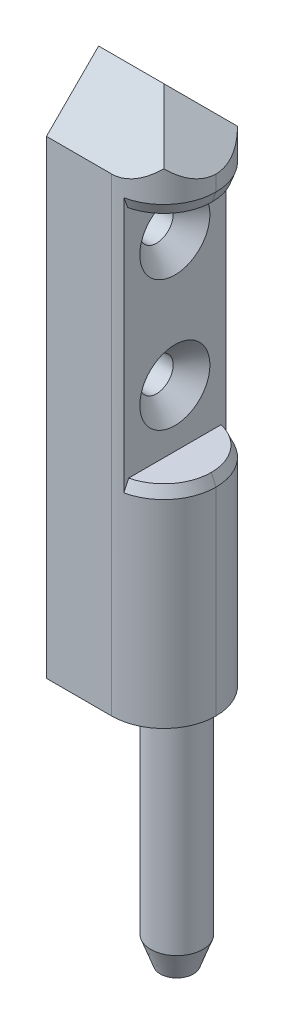
ISO-10303-21;
HEADER;
FILE_DESCRIPTION(('STEP AP214'),'2;1');
FILE_NAME('part.step','',(''),(''),'','','');
FILE_SCHEMA(('AUTOMOTIVE_DESIGN { 1 0 10303 214 1 1 1 1 }'));
ENDSEC;
DATA;
#1=APPLICATION_CONTEXT('core data for automotive mechanical design processes');
#2=APPLICATION_PROTOCOL_DEFINITION('international standard','automotive_design',2000,#1);
#3=PRODUCT_CONTEXT('',#1,'mechanical');
#4=PRODUCT('Part','Part','',(#3));
#5=PRODUCT_RELATED_PRODUCT_CATEGORY('part','',(#4));
#6=PRODUCT_DEFINITION_FORMATION('','',#4);
#7=PRODUCT_DEFINITION_CONTEXT('part definition',#1,'design');
#8=PRODUCT_DEFINITION('design','',#6,#7);
#9=PRODUCT_DEFINITION_SHAPE('','',#8);
#10=(LENGTH_UNIT() NAMED_UNIT(*) SI_UNIT(.MILLI.,.METRE.));
#11=(NAMED_UNIT(*) PLANE_ANGLE_UNIT() SI_UNIT($,.RADIAN.));
#12=(NAMED_UNIT(*) SI_UNIT($,.STERADIAN.) SOLID_ANGLE_UNIT());
#13=UNCERTAINTY_MEASURE_WITH_UNIT(LENGTH_MEASURE(1.E-05),#10,'distance_accuracy_value','');
#14=(GEOMETRIC_REPRESENTATION_CONTEXT(3) GLOBAL_UNCERTAINTY_ASSIGNED_CONTEXT((#13)) GLOBAL_UNIT_ASSIGNED_CONTEXT((#10,
#11,#12)) REPRESENTATION_CONTEXT('',''));
#15=CARTESIAN_POINT('',(0.,0.,0.));
#16=DIRECTION('',(0.,0.,1.));
#17=DIRECTION('',(1.,0.,0.));
#18=AXIS2_PLACEMENT_3D('',#15,#16,#17);
#19=CARTESIAN_POINT('',(0.,100.,10.));
#20=DIRECTION('',(1.,0.,0.));
#21=DIRECTION('',(0.,0.,-1.));
#22=AXIS2_PLACEMENT_3D('',#19,#20,#21);
#23=PLANE('',#22);
#24=CARTESIAN_POINT('',(0.,76.,0.));
#25=DIRECTION('',(1.,0.,0.));
#26=DIRECTION('',(0.,0.,-1.));
#27=AXIS2_PLACEMENT_3D('',#24,#25,#26);
#28=CIRCLE('',#27,3.19999999999999);
#29=CARTESIAN_POINT('',(0.,76.,-3.19999999999999));
#30=VERTEX_POINT('',#29);
#31=EDGE_CURVE('E323',#30,#30,#28,.T.);
#32=ORIENTED_EDGE('',*,*,#31,.T.);
#33=EDGE_LOOP('',(#32));
#34=FACE_BOUND('',#33,.T.);
#35=CARTESIAN_POINT('',(0.,51.,0.));
#36=DIRECTION('',(1.,0.,0.));
#37=DIRECTION('',(0.,0.,-1.));
#38=AXIS2_PLACEMENT_3D('',#35,#36,#37);
#39=CIRCLE('',#38,3.19999999999999);
#40=CARTESIAN_POINT('',(0.,51.,-3.19999999999999));
#41=VERTEX_POINT('',#40);
#42=EDGE_CURVE('E318',#41,#41,#39,.T.);
#43=ORIENTED_EDGE('',*,*,#42,.T.);
#44=EDGE_LOOP('',(#43));
#45=FACE_BOUND('',#44,.T.);
#46=DIRECTION('',(0.,-0.707106781186549,0.707106781186546));
#47=VECTOR('',#46,1.);
#48=CARTESIAN_POINT('',(0.,100.,0.));
#49=LINE('',#48,#47);
#50=CARTESIAN_POINT('',(0.,90.,10.));
#51=VERTEX_POINT('',#50);
#52=CARTESIAN_POINT('',(0.,100.,0.));
#53=VERTEX_POINT('',#52);
#54=EDGE_CURVE('E167',#51,#53,#49,.F.);
#55=ORIENTED_EDGE('',*,*,#54,.T.);
#56=DIRECTION('',(0.,0.707106781186549,0.707106781186546));
#57=VECTOR('',#56,1.);
#58=CARTESIAN_POINT('',(0.,100.,0.));
#59=LINE('',#58,#57);
#60=CARTESIAN_POINT('',(0.,90.,-10.));
#61=VERTEX_POINT('',#60);
#62=EDGE_CURVE('E165',#53,#61,#59,.F.);
#63=ORIENTED_EDGE('',*,*,#62,.T.);
#64=DIRECTION('',(0.,-1.,0.));
#65=VECTOR('',#64,1.);
#66=CARTESIAN_POINT('',(0.,100.,-10.));
#67=LINE('',#66,#65);
#68=CARTESIAN_POINT('',(0.,0.,-10.));
#69=VERTEX_POINT('',#68);
#70=EDGE_CURVE('E149',#61,#69,#67,.T.);
#71=ORIENTED_EDGE('',*,*,#70,.T.);
#72=DIRECTION('',(0.,0.,1.));
#73=VECTOR('',#72,1.);
#74=CARTESIAN_POINT('',(0.,0.,10.));
#75=LINE('',#74,#73);
#76=CARTESIAN_POINT('',(0.,0.,10.));
#77=VERTEX_POINT('',#76);
#78=EDGE_CURVE('E163',#69,#77,#75,.T.);
#79=ORIENTED_EDGE('',*,*,#78,.T.);
#80=DIRECTION('',(0.,-1.,0.));
#81=VECTOR('',#80,1.);
#82=CARTESIAN_POINT('',(0.,100.,10.));
#83=LINE('',#82,#81);
#84=EDGE_CURVE('E157',#51,#77,#83,.T.);
#85=ORIENTED_EDGE('',*,*,#84,.F.);
#86=EDGE_LOOP('',(#55,#63,#71,#79,#85));
#87=FACE_BOUND('',#86,.T.);
#88=ADVANCED_FACE('F47',(#34,#45,#87),#23,.F.);
#89=CARTESIAN_POINT('',(2.12,100.,10.));
#90=DIRECTION('',(0.,0.,-1.));
#91=DIRECTION('',(-1.,0.,0.));
#92=AXIS2_PLACEMENT_3D('',#89,#90,#91);
#93=PLANE('',#92);
#94=DIRECTION('',(1.,0.,0.));
#95=VECTOR('',#94,1.);
#96=CARTESIAN_POINT('',(2.12,0.,10.));
#97=LINE('',#96,#95);
#98=CARTESIAN_POINT('',(12.5,0.,10.));
#99=VERTEX_POINT('',#98);
#100=EDGE_CURVE('E158',#77,#99,#97,.T.);
#101=ORIENTED_EDGE('',*,*,#100,.T.);
#102=DIRECTION('',(0.,-1.,0.));
#103=VECTOR('',#102,1.);
#104=CARTESIAN_POINT('',(12.5,100.,10.));
#105=LINE('',#104,#103);
#106=CARTESIAN_POINT('',(12.5,90.,10.));
#107=VERTEX_POINT('',#106);
#108=EDGE_CURVE('E220',#99,#107,#105,.F.);
#109=ORIENTED_EDGE('',*,*,#108,.T.);
#110=DIRECTION('',(-1.,0.,0.));
#111=VECTOR('',#110,1.);
#112=CARTESIAN_POINT('',(2.12,90.,10.));
#113=LINE('',#112,#111);
#114=EDGE_CURVE('E192',#107,#51,#113,.T.);
#115=ORIENTED_EDGE('',*,*,#114,.T.);
#116=ORIENTED_EDGE('',*,*,#84,.T.);
#117=EDGE_LOOP('',(#101,#109,#115,#116));
#118=FACE_BOUND('',#117,.T.);
#119=ADVANCED_FACE('F343',(#118),#93,.F.);
#120=CARTESIAN_POINT('',(2.12,100.,-10.));
#121=DIRECTION('',(0.,0.,1.));
#122=DIRECTION('',(1.,0.,0.));
#123=AXIS2_PLACEMENT_3D('',#120,#121,#122);
#124=PLANE('',#123);
#125=DIRECTION('',(1.,0.,0.));
#126=VECTOR('',#125,1.);
#127=CARTESIAN_POINT('',(2.12,90.,-10.));
#128=LINE('',#127,#126);
#129=CARTESIAN_POINT('',(12.5,90.,-10.));
#130=VERTEX_POINT('',#129);
#131=EDGE_CURVE('E189',#61,#130,#128,.T.);
#132=ORIENTED_EDGE('',*,*,#131,.T.);
#133=DIRECTION('',(0.,-1.,0.));
#134=VECTOR('',#133,1.);
#135=CARTESIAN_POINT('',(12.5,100.,-10.));
#136=LINE('',#135,#134);
#137=CARTESIAN_POINT('',(12.5,0.,-10.));
#138=VERTEX_POINT('',#137);
#139=EDGE_CURVE('E152',#130,#138,#136,.T.);
#140=ORIENTED_EDGE('',*,*,#139,.T.);
#141=DIRECTION('',(-1.,0.,0.));
#142=VECTOR('',#141,1.);
#143=CARTESIAN_POINT('',(2.12,0.,-10.));
#144=LINE('',#143,#142);
#145=EDGE_CURVE('E145',#138,#69,#144,.T.);
#146=ORIENTED_EDGE('',*,*,#145,.T.);
#147=ORIENTED_EDGE('',*,*,#70,.F.);
#148=EDGE_LOOP('',(#132,#140,#146,#147));
#149=FACE_BOUND('',#148,.T.);
#150=ADVANCED_FACE('F148',(#149),#124,.F.);
#151=CARTESIAN_POINT('',(0.,0.,0.));
#152=DIRECTION('',(0.,-1.,0.));
#153=DIRECTION('',(0.,0.,-1.));
#154=AXIS2_PLACEMENT_3D('',#151,#152,#153);
#155=PLANE('',#154);
#156=CARTESIAN_POINT('',(15.,0.,0.));
#157=DIRECTION('',(0.,-1.,0.));
#158=DIRECTION('',(0.,0.,-1.));
#159=AXIS2_PLACEMENT_3D('',#156,#157,#158);
#160=CIRCLE('',#159,4.99999999999999);
#161=CARTESIAN_POINT('',(15.,0.,4.99999999999999));
#162=VERTEX_POINT('',#161);
#163=EDGE_CURVE('E434',#162,#162,#160,.T.);
#164=ORIENTED_EDGE('',*,*,#163,.F.);
#165=EDGE_LOOP('',(#164));
#166=FACE_BOUND('',#165,.T.);
#167=ORIENTED_EDGE('',*,*,#145,.F.);
#168=CARTESIAN_POINT('',(12.5,0.,0.));
#169=DIRECTION('',(0.,-1.,0.));
#170=DIRECTION('',(0.,0.,-1.));
#171=AXIS2_PLACEMENT_3D('',#168,#169,#170);
#172=CIRCLE('',#171,10.);
#173=CARTESIAN_POINT('',(22.5,0.,0.));
#174=VERTEX_POINT('',#173);
#175=EDGE_CURVE('E208',#138,#174,#172,.T.);
#176=ORIENTED_EDGE('',*,*,#175,.T.);
#177=CARTESIAN_POINT('',(12.5,0.,0.));
#178=DIRECTION('',(0.,-1.,0.));
#179=DIRECTION('',(0.,0.,-1.));
#180=AXIS2_PLACEMENT_3D('',#177,#178,#179);
#181=CIRCLE('',#180,10.);
#182=EDGE_CURVE('E205',#174,#99,#181,.T.);
#183=ORIENTED_EDGE('',*,*,#182,.T.);
#184=ORIENTED_EDGE('',*,*,#100,.F.);
#185=ORIENTED_EDGE('',*,*,#78,.F.);
#186=EDGE_LOOP('',(#167,#176,#183,#184,#185));
#187=FACE_BOUND('',#186,.T.);
#188=ADVANCED_FACE('F170',(#166,#187),#155,.T.);
#189=CARTESIAN_POINT('',(12.5,100.,0.));
#190=DIRECTION('',(-0.707106781186549,-0.707106781186546,0.));
#191=DIRECTION('',(0.,0.,-1.));
#192=AXIS2_PLACEMENT_3D('',#189,#190,#191);
#193=PLANE('',#192);
#194=CARTESIAN_POINT('',(12.5,100.,0.));
#195=DIRECTION('',(-0.707106781186549,-0.707106781186546,0.));
#196=DIRECTION('',(0.707106781186546,-0.707106781186549,0.));
#197=AXIS2_PLACEMENT_3D('',#194,#195,#196);
#198=ELLIPSE('',#197,14.142135623731,10.);
#199=CARTESIAN_POINT('',(19.5710678118655,92.9289321881345,7.07106781186547));
#200=VERTEX_POINT('',#199);
#201=CARTESIAN_POINT('',(22.5,90.,0.));
#202=VERTEX_POINT('',#201);
#203=EDGE_CURVE('E211',#200,#202,#198,.F.);
#204=ORIENTED_EDGE('',*,*,#203,.T.);
#205=CARTESIAN_POINT('',(12.5,100.,0.));
#206=DIRECTION('',(-0.707106781186549,-0.707106781186546,0.));
#207=DIRECTION('',(0.707106781186546,-0.707106781186549,0.));
#208=AXIS2_PLACEMENT_3D('',#205,#206,#207);
#209=ELLIPSE('',#208,14.142135623731,10.);
#210=CARTESIAN_POINT('',(19.5710678118655,92.9289321881345,-7.07106781186548));
#211=VERTEX_POINT('',#210);
#212=EDGE_CURVE('E214',#202,#211,#209,.F.);
#213=ORIENTED_EDGE('',*,*,#212,.T.);
#214=DIRECTION('',(-0.577350269189625,0.577350269189628,0.577350269189625));
#215=VECTOR('',#214,1.);
#216=CARTESIAN_POINT('',(12.5,100.,0.));
#217=LINE('',#216,#215);
#218=CARTESIAN_POINT('',(12.5,100.,0.));
#219=VERTEX_POINT('',#218);
#220=EDGE_CURVE('E178',#219,#211,#217,.F.);
#221=ORIENTED_EDGE('',*,*,#220,.F.);
#222=DIRECTION('',(-0.577350269189625,0.577350269189628,-0.577350269189625));
#223=VECTOR('',#222,1.);
#224=CARTESIAN_POINT('',(8.33333333333336,104.166666666667,-4.16666666666665));
#225=LINE('',#224,#223);
#226=EDGE_CURVE('E173',#200,#219,#225,.T.);
#227=ORIENTED_EDGE('',*,*,#226,.F.);
#228=EDGE_LOOP('',(#204,#213,#221,#227));
#229=FACE_BOUND('',#228,.T.);
#230=ADVANCED_FACE('F367',(#229),#193,.F.);
#231=CARTESIAN_POINT('',(0.,100.,0.));
#232=DIRECTION('',(0.,-0.707106781186546,-0.707106781186549));
#233=DIRECTION('',(1.,0.,0.));
#234=AXIS2_PLACEMENT_3D('',#231,#232,#233);
#235=PLANE('',#234);
#236=ORIENTED_EDGE('',*,*,#114,.F.);
#237=CARTESIAN_POINT('',(12.5,100.,0.));
#238=DIRECTION('',(0.,-0.707106781186546,-0.707106781186549));
#239=DIRECTION('',(0.,-0.707106781186549,0.707106781186546));
#240=AXIS2_PLACEMENT_3D('',#237,#238,#239);
#241=ELLIPSE('',#240,14.142135623731,10.);
#242=EDGE_CURVE('E223',#107,#200,#241,.F.);
#243=ORIENTED_EDGE('',*,*,#242,.T.);
#244=ORIENTED_EDGE('',*,*,#226,.T.);
#245=DIRECTION('',(1.,0.,0.));
#246=VECTOR('',#245,1.);
#247=CARTESIAN_POINT('',(0.,100.,0.));
#248=LINE('',#247,#246);
#249=EDGE_CURVE('E195',#53,#219,#248,.T.);
#250=ORIENTED_EDGE('',*,*,#249,.F.);
#251=ORIENTED_EDGE('',*,*,#54,.F.);
#252=EDGE_LOOP('',(#236,#243,#244,#250,#251));
#253=FACE_BOUND('',#252,.T.);
#254=ADVANCED_FACE('F360',(#253),#235,.F.);
#255=CARTESIAN_POINT('',(0.,100.,0.));
#256=DIRECTION('',(0.,-0.707106781186546,0.707106781186549));
#257=DIRECTION('',(-1.,0.,0.));
#258=AXIS2_PLACEMENT_3D('',#255,#256,#257);
#259=PLANE('',#258);
#260=ORIENTED_EDGE('',*,*,#220,.T.);
#261=CARTESIAN_POINT('',(12.5,100.,0.));
#262=DIRECTION('',(0.,-0.707106781186546,0.707106781186549));
#263=DIRECTION('',(0.,-0.707106781186549,-0.707106781186546));
#264=AXIS2_PLACEMENT_3D('',#261,#262,#263);
#265=ELLIPSE('',#264,14.142135623731,10.);
#266=EDGE_CURVE('E217',#211,#130,#265,.F.);
#267=ORIENTED_EDGE('',*,*,#266,.T.);
#268=ORIENTED_EDGE('',*,*,#131,.F.);
#269=ORIENTED_EDGE('',*,*,#62,.F.);
#270=ORIENTED_EDGE('',*,*,#249,.T.);
#271=EDGE_LOOP('',(#260,#267,#268,#269,#270));
#272=FACE_BOUND('',#271,.T.);
#273=ADVANCED_FACE('F354',(#272),#259,.F.);
#274=CARTESIAN_POINT('',(12.5,100.,0.));
#275=DIRECTION('',(0.,-1.,0.));
#276=DIRECTION('',(0.,0.,-1.));
#277=AXIS2_PLACEMENT_3D('',#274,#275,#276);
#278=CYLINDRICAL_SURFACE('',#277,10.);
#279=DIRECTION('',(0.,-1.,0.));
#280=VECTOR('',#279,1.);
#281=CARTESIAN_POINT('',(14.62,100.,9.7726966595715));
#282=LINE('',#281,#280);
#283=CARTESIAN_POINT('',(14.62,87.,9.7726966595715));
#284=VERTEX_POINT('',#283);
#285=CARTESIAN_POINT('',(14.62,38.,9.7726966595715));
#286=VERTEX_POINT('',#285);
#287=EDGE_CURVE('E72',#284,#286,#282,.T.);
#288=ORIENTED_EDGE('',*,*,#287,.F.);
#289=CARTESIAN_POINT('',(12.5,87.,0.));
#290=DIRECTION('',(0.,1.,0.));
#291=DIRECTION('',(0.,0.,1.));
#292=AXIS2_PLACEMENT_3D('',#289,#290,#291);
#293=CIRCLE('',#292,10.);
#294=CARTESIAN_POINT('',(22.5,87.,0.));
#295=VERTEX_POINT('',#294);
#296=EDGE_CURVE('E395',#284,#295,#293,.T.);
#297=ORIENTED_EDGE('',*,*,#296,.T.);
#298=DIRECTION('',(0.,-1.,0.));
#299=VECTOR('',#298,1.);
#300=CARTESIAN_POINT('',(22.5,100.,0.));
#301=LINE('',#300,#299);
#302=EDGE_CURVE('E199',#202,#295,#301,.T.);
#303=ORIENTED_EDGE('',*,*,#302,.F.);
#304=ORIENTED_EDGE('',*,*,#203,.F.);
#305=ORIENTED_EDGE('',*,*,#242,.F.);
#306=ORIENTED_EDGE('',*,*,#108,.F.);
#307=ORIENTED_EDGE('',*,*,#182,.F.);
#308=CARTESIAN_POINT('',(22.5,38.,0.));
#309=VERTEX_POINT('',#308);
#310=EDGE_CURVE('E229',#309,#174,#301,.T.);
#311=ORIENTED_EDGE('',*,*,#310,.F.);
#312=CARTESIAN_POINT('',(12.5,38.,0.));
#313=DIRECTION('',(0.,-1.,0.));
#314=DIRECTION('',(0.,0.,-1.));
#315=AXIS2_PLACEMENT_3D('',#312,#313,#314);
#316=CIRCLE('',#315,10.);
#317=EDGE_CURVE('E239',#309,#286,#316,.T.);
#318=ORIENTED_EDGE('',*,*,#317,.T.);
#319=EDGE_LOOP('',(#288,#297,#303,#304,#305,#306,#307,#311,#318));
#320=FACE_BOUND('',#319,.T.);
#321=ADVANCED_FACE('F277',(#320),#278,.T.);
#322=CARTESIAN_POINT('',(12.5,100.,0.));
#323=DIRECTION('',(0.,-1.,0.));
#324=DIRECTION('',(0.,0.,-1.));
#325=AXIS2_PLACEMENT_3D('',#322,#323,#324);
#326=CYLINDRICAL_SURFACE('',#325,10.);
#327=ORIENTED_EDGE('',*,*,#302,.T.);
#328=CARTESIAN_POINT('',(12.5,87.,0.));
#329=DIRECTION('',(0.,1.,0.));
#330=DIRECTION('',(0.,0.,1.));
#331=AXIS2_PLACEMENT_3D('',#328,#329,#330);
#332=CIRCLE('',#331,10.);
#333=CARTESIAN_POINT('',(14.62,87.,-9.7726966595715));
#334=VERTEX_POINT('',#333);
#335=EDGE_CURVE('E305',#295,#334,#332,.T.);
#336=ORIENTED_EDGE('',*,*,#335,.T.);
#337=DIRECTION('',(0.,-1.,0.));
#338=VECTOR('',#337,1.);
#339=CARTESIAN_POINT('',(14.62,100.,-9.7726966595715));
#340=LINE('',#339,#338);
#341=CARTESIAN_POINT('',(14.62,38.,-9.7726966595715));
#342=VERTEX_POINT('',#341);
#343=EDGE_CURVE('E64',#342,#334,#340,.F.);
#344=ORIENTED_EDGE('',*,*,#343,.F.);
#345=CARTESIAN_POINT('',(12.5,38.,0.));
#346=DIRECTION('',(0.,-1.,0.));
#347=DIRECTION('',(0.,0.,-1.));
#348=AXIS2_PLACEMENT_3D('',#345,#346,#347);
#349=CIRCLE('',#348,10.);
#350=EDGE_CURVE('E242',#342,#309,#349,.T.);
#351=ORIENTED_EDGE('',*,*,#350,.T.);
#352=ORIENTED_EDGE('',*,*,#310,.T.);
#353=ORIENTED_EDGE('',*,*,#175,.F.);
#354=ORIENTED_EDGE('',*,*,#139,.F.);
#355=ORIENTED_EDGE('',*,*,#266,.F.);
#356=ORIENTED_EDGE('',*,*,#212,.F.);
#357=EDGE_LOOP('',(#327,#336,#344,#351,#352,#353,#354,#355,#356));
#358=FACE_BOUND('',#357,.T.);
#359=ADVANCED_FACE('F373',(#358),#326,.T.);
#360=CARTESIAN_POINT('',(114.62,40.,-10.));
#361=DIRECTION('',(0.,-1.,0.));
#362=DIRECTION('',(0.,0.,-1.));
#363=AXIS2_PLACEMENT_3D('',#360,#361,#362);
#364=PLANE('',#363);
#365=DIRECTION('',(0.,0.,1.));
#366=VECTOR('',#365,1.);
#367=CARTESIAN_POINT('',(14.62,40.,-10.));
#368=LINE('',#367,#366);
#369=CARTESIAN_POINT('',(14.62,40.,-8.85942249339906));
#370=VERTEX_POINT('',#369);
#371=CARTESIAN_POINT('',(14.62,40.,8.85942249339906));
#372=VERTEX_POINT('',#371);
#373=EDGE_CURVE('E409',#370,#372,#368,.T.);
#374=ORIENTED_EDGE('',*,*,#373,.T.);
#375=CARTESIAN_POINT('',(12.5,40.,0.));
#376=DIRECTION('',(0.,-1.,0.));
#377=DIRECTION('',(0.,0.,-1.));
#378=AXIS2_PLACEMENT_3D('',#375,#376,#377);
#379=CIRCLE('',#378,9.10954262938294);
#380=CARTESIAN_POINT('',(21.609542629383,40.,0.));
#381=VERTEX_POINT('',#380);
#382=EDGE_CURVE('E235',#372,#381,#379,.F.);
#383=ORIENTED_EDGE('',*,*,#382,.T.);
#384=CARTESIAN_POINT('',(12.5,40.,0.));
#385=DIRECTION('',(0.,-1.,0.));
#386=DIRECTION('',(0.,0.,-1.));
#387=AXIS2_PLACEMENT_3D('',#384,#385,#386);
#388=CIRCLE('',#387,9.10954262938295);
#389=EDGE_CURVE('E232',#381,#370,#388,.F.);
#390=ORIENTED_EDGE('',*,*,#389,.T.);
#391=EDGE_LOOP('',(#374,#383,#390));
#392=FACE_BOUND('',#391,.T.);
#393=ADVANCED_FACE('F375',(#392),#364,.F.);
#394=CARTESIAN_POINT('',(114.62,85.,10.));
#395=DIRECTION('',(0.,1.,0.));
#396=DIRECTION('',(0.,0.,1.));
#397=AXIS2_PLACEMENT_3D('',#394,#395,#396);
#398=PLANE('',#397);
#399=CARTESIAN_POINT('',(12.5,85.,0.));
#400=DIRECTION('',(0.,1.,0.));
#401=DIRECTION('',(0.,0.,1.));
#402=AXIS2_PLACEMENT_3D('',#399,#400,#401);
#403=CIRCLE('',#402,9.27205953146757);
#404=CARTESIAN_POINT('',(14.62,85.,-9.0264438155388));
#405=VERTEX_POINT('',#404);
#406=CARTESIAN_POINT('',(21.7720595314676,85.,0.));
#407=VERTEX_POINT('',#406);
#408=EDGE_CURVE('E403',#405,#407,#403,.F.);
#409=ORIENTED_EDGE('',*,*,#408,.T.);
#410=CARTESIAN_POINT('',(12.5,85.,0.));
#411=DIRECTION('',(0.,1.,0.));
#412=DIRECTION('',(0.,0.,1.));
#413=AXIS2_PLACEMENT_3D('',#410,#411,#412);
#414=CIRCLE('',#413,9.27205953146757);
#415=CARTESIAN_POINT('',(14.62,85.,9.0264438155388));
#416=VERTEX_POINT('',#415);
#417=EDGE_CURVE('E398',#407,#416,#414,.F.);
#418=ORIENTED_EDGE('',*,*,#417,.T.);
#419=DIRECTION('',(0.,0.,-1.));
#420=VECTOR('',#419,1.);
#421=CARTESIAN_POINT('',(14.62,85.,10.));
#422=LINE('',#421,#420);
#423=EDGE_CURVE('E416',#416,#405,#422,.T.);
#424=ORIENTED_EDGE('',*,*,#423,.T.);
#425=EDGE_LOOP('',(#409,#418,#424));
#426=FACE_BOUND('',#425,.T.);
#427=ADVANCED_FACE('F381',(#426),#398,.F.);
#428=CARTESIAN_POINT('',(14.62,0.,0.));
#429=DIRECTION('',(-1.,0.,0.));
#430=DIRECTION('',(0.,0.,1.));
#431=AXIS2_PLACEMENT_3D('',#428,#429,#430);
#432=PLANE('',#431);
#433=CARTESIAN_POINT('',(14.62,76.,0.));
#434=DIRECTION('',(1.,0.,0.));
#435=DIRECTION('',(0.,0.,-1.));
#436=AXIS2_PLACEMENT_3D('',#433,#434,#435);
#437=CIRCLE('',#436,6.72);
#438=CARTESIAN_POINT('',(14.62,76.,-6.72));
#439=VERTEX_POINT('',#438);
#440=EDGE_CURVE('E430',#439,#439,#437,.T.);
#441=ORIENTED_EDGE('',*,*,#440,.F.);
#442=EDGE_LOOP('',(#441));
#443=FACE_BOUND('',#442,.T.);
#444=CARTESIAN_POINT('',(14.62,51.,0.));
#445=DIRECTION('',(1.,0.,0.));
#446=DIRECTION('',(0.,0.,-1.));
#447=AXIS2_PLACEMENT_3D('',#444,#445,#446);
#448=CIRCLE('',#447,6.72);
#449=CARTESIAN_POINT('',(14.62,51.,-6.72));
#450=VERTEX_POINT('',#449);
#451=EDGE_CURVE('E326',#450,#450,#448,.T.);
#452=ORIENTED_EDGE('',*,*,#451,.F.);
#453=EDGE_LOOP('',(#452));
#454=FACE_BOUND('',#453,.T.);
#455=ORIENTED_EDGE('',*,*,#287,.T.);
#456=CARTESIAN_POINT('',(14.62,38.,9.7726966595715));
#457=CARTESIAN_POINT('',(14.62,38.3334724288597,9.62078891560253));
#458=CARTESIAN_POINT('',(14.62,38.6668753083353,9.46872886384559));
#459=CARTESIAN_POINT('',(14.62,39.3335419750047,9.16430414179404));
#460=CARTESIAN_POINT('',(14.62,39.6668057621957,9.01193947149349));
#461=CARTESIAN_POINT('',(14.62,39.9999999999999,8.85942249339906));
#462=B_SPLINE_CURVE_WITH_KNOTS('',3,(#456,#457,#458,#459,#460,#461),.UNSPECIFIED.,.F.,.F.,(4,2,
4),(0.,1.0993260000777,2.19865202154637),.UNSPECIFIED.);
#463=EDGE_CURVE('E245',#286,#372,#462,.T.);
#464=ORIENTED_EDGE('',*,*,#463,.T.);
#465=ORIENTED_EDGE('',*,*,#373,.F.);
#466=CARTESIAN_POINT('',(14.62,40.,-8.85942249339906));
#467=CARTESIAN_POINT('',(14.62,39.6668057621957,-9.01193947149349));
#468=CARTESIAN_POINT('',(14.62,39.3335419750047,-9.16430414179404));
#469=CARTESIAN_POINT('',(14.62,38.6668753083353,-9.46872886384559));
#470=CARTESIAN_POINT('',(14.62,38.3334724288597,-9.62078891560252));
#471=CARTESIAN_POINT('',(14.62,38.,-9.7726966595715));
#472=B_SPLINE_CURVE_WITH_KNOTS('',3,(#466,#467,#468,#469,#470,#471),.UNSPECIFIED.,.F.,.F.,(4,2,
4),(0.,1.09932602146867,2.19865202154637),.UNSPECIFIED.);
#473=EDGE_CURVE('E254',#370,#342,#472,.T.);
#474=ORIENTED_EDGE('',*,*,#473,.T.);
#475=ORIENTED_EDGE('',*,*,#343,.T.);
#476=CARTESIAN_POINT('',(14.62,87.,-9.7726966595715));
#477=CARTESIAN_POINT('',(14.62,86.6665882796528,-9.64853127103235));
#478=CARTESIAN_POINT('',(14.62,86.3332157534375,-9.52426083999372));
#479=CARTESIAN_POINT('',(14.62,85.6665490867702,-9.27550989198439));
#480=CARTESIAN_POINT('',(14.62,85.3332549463188,-9.15102937501212));
#481=CARTESIAN_POINT('',(14.62,84.9999999999999,-9.0264438155388));
#482=B_SPLINE_CURVE_WITH_KNOTS('',3,(#476,#477,#478,#479,#480,#481),.UNSPECIFIED.,.F.,.F.,(4,2,
4),(0.,1.06734410168004,2.13468821136746),.UNSPECIFIED.);
#483=EDGE_CURVE('E304',#334,#405,#482,.T.);
#484=ORIENTED_EDGE('',*,*,#483,.T.);
#485=ORIENTED_EDGE('',*,*,#423,.F.);
#486=CARTESIAN_POINT('',(14.62,85.,9.0264438155388));
#487=CARTESIAN_POINT('',(14.62,85.3332549463188,9.15102937501213));
#488=CARTESIAN_POINT('',(14.62,85.6665490867702,9.27550989198439));
#489=CARTESIAN_POINT('',(14.62,86.3332157534375,9.52426083999372));
#490=CARTESIAN_POINT('',(14.62,86.6665882796528,9.64853127103235));
#491=CARTESIAN_POINT('',(14.62,87.,9.7726966595715));
#492=B_SPLINE_CURVE_WITH_KNOTS('',3,(#486,#487,#488,#489,#490,#491),.UNSPECIFIED.,.F.,.F.,(4,2,
4),(0.,1.06734410968741,2.13468821136745),.UNSPECIFIED.);
#493=EDGE_CURVE('E296',#416,#284,#492,.T.);
#494=ORIENTED_EDGE('',*,*,#493,.T.);
#495=EDGE_LOOP('',(#455,#464,#465,#474,#475,#484,#485,#494));
#496=FACE_BOUND('',#495,.T.);
#497=ADVANCED_FACE('F261',(#443,#454,#496),#432,.F.);
#498=CARTESIAN_POINT('',(12.5,40.,0.));
#499=DIRECTION('',(0.,-1.,0.));
#500=DIRECTION('',(0.,0.,-1.));
#501=AXIS2_PLACEMENT_3D('',#498,#499,#500);
#502=CONICAL_SURFACE('',#501,9.10954262938295,0.418879020478636);
#503=ORIENTED_EDGE('',*,*,#473,.F.);
#504=ORIENTED_EDGE('',*,*,#389,.F.);
#505=DIRECTION('',(-0.406736643075797,0.913545457642602,0.));
#506=VECTOR('',#505,1.);
#507=CARTESIAN_POINT('',(22.5,38.,0.));
#508=LINE('',#507,#506);
#509=EDGE_CURVE('E317',#309,#381,#508,.T.);
#510=ORIENTED_EDGE('',*,*,#509,.F.);
#511=ORIENTED_EDGE('',*,*,#350,.F.);
#512=EDGE_LOOP('',(#503,#504,#510,#511));
#513=FACE_BOUND('',#512,.T.);
#514=ADVANCED_FACE('F275',(#513),#502,.T.);
#515=CARTESIAN_POINT('',(12.5,40.,0.));
#516=DIRECTION('',(0.,-1.,0.));
#517=DIRECTION('',(0.,0.,-1.));
#518=AXIS2_PLACEMENT_3D('',#515,#516,#517);
#519=CONICAL_SURFACE('',#518,9.10954262938294,0.418879020478637);
#520=ORIENTED_EDGE('',*,*,#463,.F.);
#521=ORIENTED_EDGE('',*,*,#317,.F.);
#522=ORIENTED_EDGE('',*,*,#509,.T.);
#523=ORIENTED_EDGE('',*,*,#382,.F.);
#524=EDGE_LOOP('',(#520,#521,#522,#523));
#525=FACE_BOUND('',#524,.T.);
#526=ADVANCED_FACE('F266',(#525),#519,.T.);
#527=CARTESIAN_POINT('',(12.5,85.,0.));
#528=DIRECTION('',(0.,1.,0.));
#529=DIRECTION('',(0.,0.,1.));
#530=AXIS2_PLACEMENT_3D('',#527,#528,#529);
#531=CONICAL_SURFACE('',#530,9.27205953146757,0.349065850398861);
#532=ORIENTED_EDGE('',*,*,#483,.F.);
#533=ORIENTED_EDGE('',*,*,#335,.F.);
#534=DIRECTION('',(0.342020143325663,0.93969262078591,0.));
#535=VECTOR('',#534,1.);
#536=CARTESIAN_POINT('',(21.7720595314676,85.,0.));
#537=LINE('',#536,#535);
#538=EDGE_CURVE('E313',#407,#295,#537,.T.);
#539=ORIENTED_EDGE('',*,*,#538,.F.);
#540=ORIENTED_EDGE('',*,*,#408,.F.);
#541=EDGE_LOOP('',(#532,#533,#539,#540));
#542=FACE_BOUND('',#541,.T.);
#543=ADVANCED_FACE('F274',(#542),#531,.T.);
#544=CARTESIAN_POINT('',(12.5,85.,0.));
#545=DIRECTION('',(0.,1.,0.));
#546=DIRECTION('',(0.,0.,1.));
#547=AXIS2_PLACEMENT_3D('',#544,#545,#546);
#548=CONICAL_SURFACE('',#547,9.27205953146757,0.349065850398861);
#549=ORIENTED_EDGE('',*,*,#538,.T.);
#550=ORIENTED_EDGE('',*,*,#296,.F.);
#551=ORIENTED_EDGE('',*,*,#493,.F.);
#552=ORIENTED_EDGE('',*,*,#417,.F.);
#553=EDGE_LOOP('',(#549,#550,#551,#552));
#554=FACE_BOUND('',#553,.T.);
#555=ADVANCED_FACE('F287',(#554),#548,.T.);
#556=CARTESIAN_POINT('',(14.62,51.,0.));
#557=DIRECTION('',(1.,0.,0.));
#558=DIRECTION('',(0.,0.,-1.));
#559=AXIS2_PLACEMENT_3D('',#556,#557,#558);
#560=CYLINDRICAL_SURFACE('',#559,3.19999999999999);
#561=CARTESIAN_POINT('',(11.1,51.,0.));
#562=DIRECTION('',(1.,0.,0.));
#563=DIRECTION('',(0.,0.,-1.));
#564=AXIS2_PLACEMENT_3D('',#561,#562,#563);
#565=CIRCLE('',#564,3.19999999999999);
#566=CARTESIAN_POINT('',(11.1,51.,-3.2));
#567=VERTEX_POINT('',#566);
#568=EDGE_CURVE('E322',#567,#567,#565,.T.);
#569=ORIENTED_EDGE('',*,*,#568,.T.);
#570=EDGE_LOOP('',(#569));
#571=FACE_BOUND('',#570,.T.);
#572=ORIENTED_EDGE('',*,*,#42,.F.);
#573=EDGE_LOOP('',(#572));
#574=FACE_BOUND('',#573,.T.);
#575=ADVANCED_FACE('F292',(#571,#574),#560,.F.);
#576=CARTESIAN_POINT('',(14.62,51.,0.));
#577=DIRECTION('',(1.,0.,0.));
#578=DIRECTION('',(0.,0.,-1.));
#579=AXIS2_PLACEMENT_3D('',#576,#577,#578);
#580=CONICAL_SURFACE('',#579,6.72,0.785398163397448);
#581=ORIENTED_EDGE('',*,*,#568,.F.);
#582=EDGE_LOOP('',(#581));
#583=FACE_BOUND('',#582,.T.);
#584=ORIENTED_EDGE('',*,*,#451,.T.);
#585=EDGE_LOOP('',(#584));
#586=FACE_BOUND('',#585,.T.);
#587=ADVANCED_FACE('F471',(#583,#586),#580,.F.);
#588=CARTESIAN_POINT('',(14.62,76.,0.));
#589=DIRECTION('',(1.,0.,0.));
#590=DIRECTION('',(0.,0.,-1.));
#591=AXIS2_PLACEMENT_3D('',#588,#589,#590);
#592=CYLINDRICAL_SURFACE('',#591,3.19999999999999);
#593=CARTESIAN_POINT('',(11.1,76.,0.));
#594=DIRECTION('',(1.,0.,0.));
#595=DIRECTION('',(0.,0.,-1.));
#596=AXIS2_PLACEMENT_3D('',#593,#594,#595);
#597=CIRCLE('',#596,3.19999999999999);
#598=CARTESIAN_POINT('',(11.1,76.,-3.19999999999999));
#599=VERTEX_POINT('',#598);
#600=EDGE_CURVE('E327',#599,#599,#597,.T.);
#601=ORIENTED_EDGE('',*,*,#600,.T.);
#602=EDGE_LOOP('',(#601));
#603=FACE_BOUND('',#602,.T.);
#604=ORIENTED_EDGE('',*,*,#31,.F.);
#605=EDGE_LOOP('',(#604));
#606=FACE_BOUND('',#605,.T.);
#607=ADVANCED_FACE('F473',(#603,#606),#592,.F.);
#608=CARTESIAN_POINT('',(14.62,76.,0.));
#609=DIRECTION('',(1.,0.,0.));
#610=DIRECTION('',(0.,0.,-1.));
#611=AXIS2_PLACEMENT_3D('',#608,#609,#610);
#612=CONICAL_SURFACE('',#611,6.72,0.785398163397449);
#613=ORIENTED_EDGE('',*,*,#600,.F.);
#614=EDGE_LOOP('',(#613));
#615=FACE_BOUND('',#614,.T.);
#616=ORIENTED_EDGE('',*,*,#440,.T.);
#617=EDGE_LOOP('',(#616));
#618=FACE_BOUND('',#617,.T.);
#619=ADVANCED_FACE('F480',(#615,#618),#612,.F.);
#620=CARTESIAN_POINT('',(15.,-45.,0.));
#621=DIRECTION('',(0.,1.,0.));
#622=DIRECTION('',(0.,0.,1.));
#623=AXIS2_PLACEMENT_3D('',#620,#621,#622);
#624=CYLINDRICAL_SURFACE('',#623,4.99999999999999);
#625=CARTESIAN_POINT('',(15.,-40.0000000000004,0.));
#626=DIRECTION('',(0.,-1.,0.));
#627=DIRECTION('',(0.,0.,-1.));
#628=AXIS2_PLACEMENT_3D('',#625,#626,#627);
#629=CIRCLE('',#628,4.99999999999999);
#630=CARTESIAN_POINT('',(15.,-40.0000000000004,4.99999999999999));
#631=VERTEX_POINT('',#630);
#632=EDGE_CURVE('E11',#631,#631,#629,.F.);
#633=CARTESIAN_POINT('',(15.,-40.0000000000004,4.99999999999999));
#634=CARTESIAN_POINT('',(15.,-39.5833333333338,4.99999999999999));
#635=CARTESIAN_POINT('',(15.,-39.1666666666671,4.99999999999999));
#636=CARTESIAN_POINT('',(15.,-38.3333333333338,4.99999999999999));
#637=CARTESIAN_POINT('',(15.,-37.9166666666671,4.99999999999999));
#638=CARTESIAN_POINT('',(15.,-37.0833333333337,4.99999999999999));
#639=CARTESIAN_POINT('',(15.,-36.6666666666671,4.99999999999999));
#640=CARTESIAN_POINT('',(15.,-35.8333333333337,4.99999999999999));
#641=CARTESIAN_POINT('',(15.,-35.4166666666671,4.99999999999999));
#642=CARTESIAN_POINT('',(15.,-34.5833333333337,4.99999999999999));
#643=CARTESIAN_POINT('',(15.,-34.166666666667,4.99999999999999));
#644=CARTESIAN_POINT('',(15.,-33.3333333333337,4.99999999999999));
#645=CARTESIAN_POINT('',(15.,-32.916666666667,4.99999999999999));
#646=CARTESIAN_POINT('',(15.,-32.0833333333337,4.99999999999999));
#647=CARTESIAN_POINT('',(15.,-31.666666666667,4.99999999999999));
#648=CARTESIAN_POINT('',(15.,-30.8333333333337,4.99999999999999));
#649=CARTESIAN_POINT('',(15.,-30.416666666667,4.99999999999999));
#650=CARTESIAN_POINT('',(15.,-29.5833333333337,4.99999999999999));
#651=CARTESIAN_POINT('',(15.,-29.166666666667,4.99999999999999));
#652=CARTESIAN_POINT('',(15.,-28.3333333333336,4.99999999999999));
#653=CARTESIAN_POINT('',(15.,-27.916666666667,4.99999999999999));
#654=CARTESIAN_POINT('',(15.,-27.0833333333336,4.99999999999999));
#655=CARTESIAN_POINT('',(15.,-26.666666666667,4.99999999999999));
#656=CARTESIAN_POINT('',(15.,-25.8333333333336,4.99999999999999));
#657=CARTESIAN_POINT('',(15.,-25.4166666666669,4.99999999999999));
#658=CARTESIAN_POINT('',(15.,-24.5833333333336,4.99999999999999));
#659=CARTESIAN_POINT('',(15.,-24.1666666666669,4.99999999999999));
#660=CARTESIAN_POINT('',(15.,-23.3333333333336,4.99999999999999));
#661=CARTESIAN_POINT('',(15.,-22.9166666666669,4.99999999999999));
#662=CARTESIAN_POINT('',(15.,-22.0833333333336,4.99999999999999));
#663=CARTESIAN_POINT('',(15.,-21.6666666666669,4.99999999999999));
#664=CARTESIAN_POINT('',(15.,-20.8333333333336,4.99999999999999));
#665=CARTESIAN_POINT('',(15.,-20.4166666666669,4.99999999999999));
#666=CARTESIAN_POINT('',(15.,-19.5833333333335,4.99999999999999));
#667=CARTESIAN_POINT('',(15.,-19.1666666666669,4.99999999999999));
#668=CARTESIAN_POINT('',(15.,-18.3333333333335,4.99999999999999));
#669=CARTESIAN_POINT('',(15.,-17.9166666666669,4.99999999999999));
#670=CARTESIAN_POINT('',(15.,-17.0833333333335,4.99999999999999));
#671=CARTESIAN_POINT('',(15.,-16.6666666666668,4.99999999999999));
#672=CARTESIAN_POINT('',(15.,-15.8333333333335,4.99999999999999));
#673=CARTESIAN_POINT('',(15.,-15.4166666666668,4.99999999999999));
#674=CARTESIAN_POINT('',(15.,-14.5833333333335,4.99999999999999));
#675=CARTESIAN_POINT('',(15.,-14.1666666666668,4.99999999999999));
#676=CARTESIAN_POINT('',(15.,-13.3333333333335,4.99999999999999));
#677=CARTESIAN_POINT('',(15.,-12.9166666666668,4.99999999999999));
#678=CARTESIAN_POINT('',(15.,-12.0833333333335,4.99999999999999));
#679=CARTESIAN_POINT('',(15.,-11.6666666666668,4.99999999999999));
#680=CARTESIAN_POINT('',(15.,-10.8333333333335,4.99999999999999));
#681=CARTESIAN_POINT('',(15.,-10.4166666666668,4.99999999999999));
#682=CARTESIAN_POINT('',(15.,-9.58333333333344,4.99999999999999));
#683=CARTESIAN_POINT('',(15.,-9.16666666666677,4.99999999999999));
#684=CARTESIAN_POINT('',(15.,-8.33333333333343,4.99999999999999));
#685=CARTESIAN_POINT('',(15.,-7.91666666666675,4.99999999999999));
#686=CARTESIAN_POINT('',(15.,-7.08333333333341,4.99999999999999));
#687=CARTESIAN_POINT('',(15.,-6.66666666666674,4.99999999999999));
#688=CARTESIAN_POINT('',(15.,-5.8333333333334,4.99999999999999));
#689=CARTESIAN_POINT('',(15.,-5.41666666666672,4.99999999999999));
#690=CARTESIAN_POINT('',(15.,-4.58333333333338,4.99999999999999));
#691=CARTESIAN_POINT('',(15.,-4.16666666666671,4.99999999999999));
#692=CARTESIAN_POINT('',(15.,-3.33333333333337,4.99999999999999));
#693=CARTESIAN_POINT('',(15.,-2.91666666666669,4.99999999999999));
#694=CARTESIAN_POINT('',(15.,-2.08333333333335,4.99999999999999));
#695=CARTESIAN_POINT('',(15.,-1.66666666666668,4.99999999999999));
#696=CARTESIAN_POINT('',(15.,-0.833333333333336,4.99999999999999));
#697=CARTESIAN_POINT('',(15.,-0.416666666666665,4.99999999999999));
#698=CARTESIAN_POINT('',(15.,0.,4.99999999999999));
#699=B_SPLINE_CURVE_WITH_KNOTS('',3,(#633,#634,#635,#636,#637,#638,#639,#640,#641,#642,#643,
#644,#645,#646,#647,#648,#649,#650,#651,#652,#653,#654,#655,#656,#657,#658,#659,#660,#661,#662,
#663,#664,#665,#666,#667,#668,#669,#670,#671,#672,#673,#674,#675,#676,#677,#678,#679,#680,#681,
#682,#683,#684,#685,#686,#687,#688,#689,#690,#691,#692,#693,#694,#695,#696,#697,#698),
.UNSPECIFIED.,.F.,.F.,(4,2,2,2,2,2,2,2,2,2,2,2,2,2,2,2,2,2,2,2,2,2,2,2,2,2,2,2,2,2,2,2,4),(0.,
1.25000000000002,2.50000000000003,3.75000000000004,5.00000000000006,6.25000000000007,
7.50000000000008,8.7500000000001,10.0000000000001,11.2500000000001,12.5000000000001,
13.7500000000002,15.0000000000002,16.2500000000002,17.5000000000002,18.7500000000002,
20.0000000000002,21.2500000000002,22.5000000000003,23.7500000000003,25.0000000000003,
26.2500000000003,27.5000000000003,28.7500000000003,30.0000000000003,31.2500000000003,
32.5000000000004,33.7500000000004,35.0000000000004,36.2500000000004,37.5000000000004,
38.7500000000004,40.0000000000005),.UNSPECIFIED.);
#700=EDGE_CURVE('BSEAM339',#631,#162,#699,.T.);
#701=ORIENTED_EDGE('',*,*,#632,.T.);
#702=ORIENTED_EDGE('',*,*,#163,.T.);
#703=ORIENTED_EDGE('',*,*,#700,.T.);
#704=ORIENTED_EDGE('',*,*,#700,.F.);
#705=EDGE_LOOP('',(#701,#703,#702,#704));
#706=FACE_BOUND('',#705,.T.);
#707=ADVANCED_FACE('F339',(#706),#624,.T.);
#708=CARTESIAN_POINT('',(15.,-45.,0.));
#709=DIRECTION('',(0.,-1.,0.));
#710=DIRECTION('',(0.,0.,-1.));
#711=AXIS2_PLACEMENT_3D('',#708,#709,#710);
#712=PLANE('',#711);
#713=CARTESIAN_POINT('',(15.,-45.,0.));
#714=DIRECTION('',(0.,-1.,0.));
#715=DIRECTION('',(0.,0.,-1.));
#716=AXIS2_PLACEMENT_3D('',#713,#714,#715);
#717=CIRCLE('',#716,3.18014882866915);
#718=CARTESIAN_POINT('',(15.,-45.,-3.18014882866916));
#719=VERTEX_POINT('',#718);
#720=EDGE_CURVE('E57',#719,#719,#717,.T.);
#721=ORIENTED_EDGE('',*,*,#720,.T.);
#722=EDGE_LOOP('',(#721));
#723=FACE_BOUND('',#722,.T.);
#724=ADVANCED_FACE('F332',(#723),#712,.T.);
#725=CARTESIAN_POINT('',(15.,-45.,0.));
#726=DIRECTION('',(0.,1.,0.));
#727=DIRECTION('',(0.,0.,1.));
#728=AXIS2_PLACEMENT_3D('',#725,#726,#727);
#729=CONICAL_SURFACE('',#728,3.18014882866915,0.349065850398864);
#730=ORIENTED_EDGE('',*,*,#632,.F.);
#731=EDGE_LOOP('',(#730));
#732=FACE_BOUND('',#731,.T.);
#733=ORIENTED_EDGE('',*,*,#720,.F.);
#734=EDGE_LOOP('',(#733));
#735=FACE_BOUND('',#734,.T.);
#736=ADVANCED_FACE('F50',(#732,#735),#729,.T.);
#737=CLOSED_SHELL('',(#88,#119,#150,#188,#230,#254,#273,#321,#359,#393,#427,#497,#514,#526,#543,
#555,#575,#587,#607,#619,#707,#724,#736));
#738=MANIFOLD_SOLID_BREP('B2',#737);
#739=ADVANCED_BREP_SHAPE_REPRESENTATION('',(#18,#738),#14);
#740=SHAPE_DEFINITION_REPRESENTATION(#9,#739);
ENDSEC;
END-ISO-10303-21;
